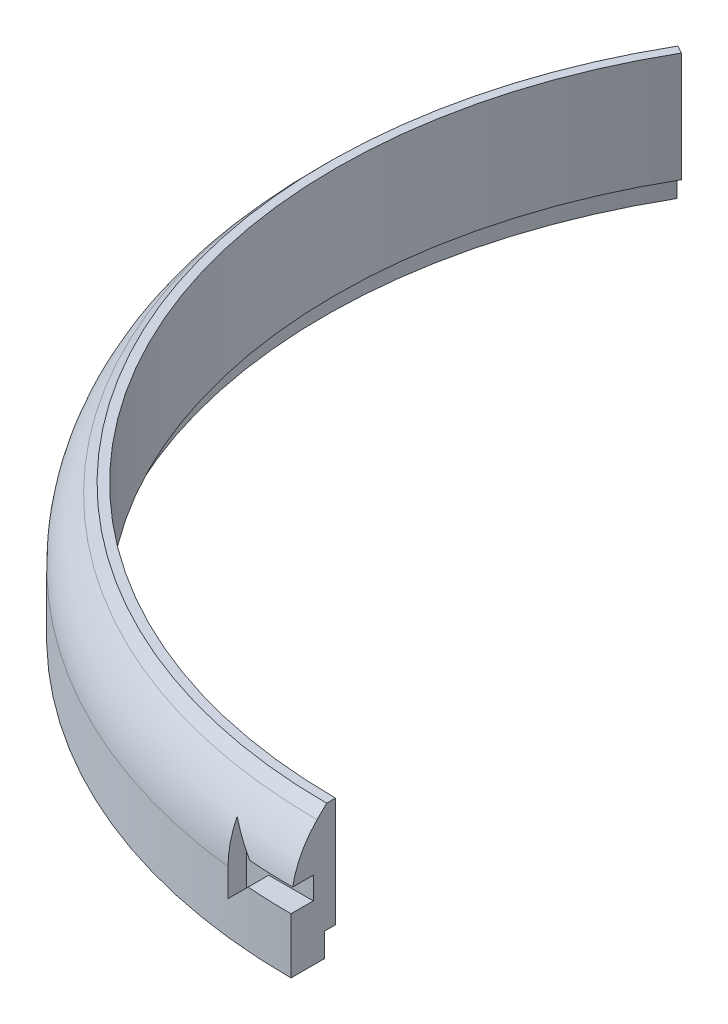
ISO-10303-21;
HEADER;
FILE_DESCRIPTION(('STEP AP214'),'2;1');
FILE_NAME('part.step','',(''),(''),'','','');
FILE_SCHEMA(('AUTOMOTIVE_DESIGN { 1 0 10303 214 1 1 1 1 }'));
ENDSEC;
DATA;
#1=APPLICATION_CONTEXT('core data for automotive mechanical design processes');
#2=APPLICATION_PROTOCOL_DEFINITION('international standard','automotive_design',2000,#1);
#3=PRODUCT_CONTEXT('',#1,'mechanical');
#4=PRODUCT('Part','Part','',(#3));
#5=PRODUCT_RELATED_PRODUCT_CATEGORY('part','',(#4));
#6=PRODUCT_DEFINITION_FORMATION('','',#4);
#7=PRODUCT_DEFINITION_CONTEXT('part definition',#1,'design');
#8=PRODUCT_DEFINITION('design','',#6,#7);
#9=PRODUCT_DEFINITION_SHAPE('','',#8);
#10=(LENGTH_UNIT() NAMED_UNIT(*) SI_UNIT(.MILLI.,.METRE.));
#11=(NAMED_UNIT(*) PLANE_ANGLE_UNIT() SI_UNIT($,.RADIAN.));
#12=(NAMED_UNIT(*) SI_UNIT($,.STERADIAN.) SOLID_ANGLE_UNIT());
#13=UNCERTAINTY_MEASURE_WITH_UNIT(LENGTH_MEASURE(1.E-05),#10,'distance_accuracy_value','');
#14=(GEOMETRIC_REPRESENTATION_CONTEXT(3) GLOBAL_UNCERTAINTY_ASSIGNED_CONTEXT((#13)) GLOBAL_UNIT_ASSIGNED_CONTEXT((#10,
#11,#12)) REPRESENTATION_CONTEXT('',''));
#15=CARTESIAN_POINT('',(0.,0.,0.));
#16=DIRECTION('',(0.,0.,1.));
#17=DIRECTION('',(1.,0.,0.));
#18=AXIS2_PLACEMENT_3D('',#15,#16,#17);
#19=CARTESIAN_POINT('',(0.,30.,0.));
#20=DIRECTION('',(0.,-1.,0.));
#21=DIRECTION('',(0.,0.,-1.));
#22=AXIS2_PLACEMENT_3D('',#19,#20,#21);
#23=CYLINDRICAL_SURFACE('',#22,132.5);
#24=DIRECTION('',(0.,-1.,0.));
#25=VECTOR('',#24,1.);
#26=CARTESIAN_POINT('',(-15.,30.,131.648205456816));
#27=LINE('',#26,#25);
#28=CARTESIAN_POINT('',(-15.,7.49999999999998,131.648205456816));
#29=VERTEX_POINT('',#28);
#30=CARTESIAN_POINT('',(-15.,13.7157287525382,131.648205456816));
#31=VERTEX_POINT('',#30);
#32=EDGE_CURVE('E349',#29,#31,#27,.F.);
#33=ORIENTED_EDGE('',*,*,#32,.T.);
#34=CARTESIAN_POINT('',(0.,13.7157287525382,0.));
#35=DIRECTION('',(0.,1.,0.));
#36=DIRECTION('',(0.,0.,1.));
#37=AXIS2_PLACEMENT_3D('',#34,#35,#36);
#38=CIRCLE('',#37,132.5);
#39=CARTESIAN_POINT('',(-121.510690288236,13.7157287525382,-52.8337216716414));
#40=VERTEX_POINT('',#39);
#41=EDGE_CURVE('E382',#31,#40,#38,.F.);
#42=ORIENTED_EDGE('',*,*,#41,.T.);
#43=DIRECTION('',(0.,-1.,0.));
#44=VECTOR('',#43,1.);
#45=CARTESIAN_POINT('',(-121.510690288236,30.,-52.8337216716414));
#46=LINE('',#45,#44);
#47=CARTESIAN_POINT('',(-121.510690288236,7.49999999999998,-52.8337216716415));
#48=VERTEX_POINT('',#47);
#49=EDGE_CURVE('E367',#48,#40,#46,.F.);
#50=ORIENTED_EDGE('',*,*,#49,.F.);
#51=CARTESIAN_POINT('',(0.,22.5,0.));
#52=DIRECTION('',(-0.353553390593275,0.707106781186546,0.612372435695795));
#53=DIRECTION('',(-0.353553390593274,-0.707106781186549,0.612372435695793));
#54=AXIS2_PLACEMENT_3D('',#51,#52,#53);
#55=ELLIPSE('',#54,187.383297014435,132.5);
#56=CARTESIAN_POINT('',(-119.421097267943,12.5,-57.4007972707748));
#57=VERTEX_POINT('',#56);
#58=EDGE_CURVE('E364',#57,#48,#55,.T.);
#59=ORIENTED_EDGE('',*,*,#58,.F.);
#60=CARTESIAN_POINT('',(0.,12.5,0.));
#61=DIRECTION('',(0.,-1.,0.));
#62=DIRECTION('',(0.,0.,-1.));
#63=AXIS2_PLACEMENT_3D('',#60,#61,#62);
#64=CIRCLE('',#63,132.5);
#65=CARTESIAN_POINT('',(-114.748366001438,12.5,-66.2500000000006));
#66=VERTEX_POINT('',#65);
#67=EDGE_CURVE('E360',#57,#66,#64,.T.);
#68=ORIENTED_EDGE('',*,*,#67,.T.);
#69=DIRECTION('',(0.,-1.,0.));
#70=VECTOR('',#69,1.);
#71=CARTESIAN_POINT('',(-114.748366001438,30.,-66.2500000000006));
#72=LINE('',#71,#70);
#73=CARTESIAN_POINT('',(-114.748366001438,0.,-66.2500000000006));
#74=VERTEX_POINT('',#73);
#75=EDGE_CURVE('E330',#66,#74,#72,.T.);
#76=ORIENTED_EDGE('',*,*,#75,.T.);
#77=CARTESIAN_POINT('',(0.,0.,0.));
#78=DIRECTION('',(0.,1.,0.));
#79=DIRECTION('',(0.,0.,1.));
#80=AXIS2_PLACEMENT_3D('',#77,#78,#79);
#81=CIRCLE('',#80,132.5);
#82=CARTESIAN_POINT('',(0.,0.,132.5));
#83=VERTEX_POINT('',#82);
#84=EDGE_CURVE('E313',#74,#83,#81,.T.);
#85=ORIENTED_EDGE('',*,*,#84,.T.);
#86=DIRECTION('',(0.,-1.,0.));
#87=VECTOR('',#86,1.);
#88=CARTESIAN_POINT('',(0.,30.,132.5));
#89=LINE('',#88,#87);
#90=CARTESIAN_POINT('',(0.,12.5,132.5));
#91=VERTEX_POINT('',#90);
#92=EDGE_CURVE('E334',#91,#83,#89,.T.);
#93=ORIENTED_EDGE('',*,*,#92,.F.);
#94=CARTESIAN_POINT('',(0.,12.5,0.));
#95=DIRECTION('',(0.,1.,0.));
#96=DIRECTION('',(-1.,0.,0.));
#97=AXIS2_PLACEMENT_3D('',#94,#95,#96);
#98=CIRCLE('',#97,132.5);
#99=CARTESIAN_POINT('',(-10.,12.5,132.122102617238));
#100=VERTEX_POINT('',#99);
#101=EDGE_CURVE('E357',#100,#91,#98,.T.);
#102=ORIENTED_EDGE('',*,*,#101,.F.);
#103=CARTESIAN_POINT('',(0.,22.5,0.));
#104=DIRECTION('',(0.707106781186549,-0.707106781186546,0.));
#105=DIRECTION('',(-0.707106781186546,-0.707106781186549,0.));
#106=AXIS2_PLACEMENT_3D('',#103,#104,#105);
#107=ELLIPSE('',#106,187.383297014435,132.5);
#108=EDGE_CURVE('E353',#100,#29,#107,.T.);
#109=ORIENTED_EDGE('',*,*,#108,.T.);
#110=EDGE_LOOP('',(#33,#42,#50,#59,#68,#76,#85,#93,#102,#109));
#111=FACE_BOUND('',#110,.T.);
#112=ADVANCED_FACE('F45',(#111),#23,.T.);
#113=CARTESIAN_POINT('',(-114.748366001438,30.,-66.2500000000005));
#114=DIRECTION('',(0.500000000000001,0.,-0.866025403784438));
#115=DIRECTION('',(-0.866025403784438,0.,-0.500000000000001));
#116=AXIS2_PLACEMENT_3D('',#113,#114,#115);
#117=PLANE('',#116);
#118=DIRECTION('',(-0.866025403784438,0.,-0.500000000000001));
#119=VECTOR('',#118,1.);
#120=CARTESIAN_POINT('',(-110.418238982516,17.5,-63.7500000000001));
#121=LINE('',#120,#119);
#122=CARTESIAN_POINT('',(-110.418238982516,17.5,-63.7500000000001));
#123=VERTEX_POINT('',#122);
#124=CARTESIAN_POINT('',(-114.435487635507,17.5,-66.0693595912061));
#125=VERTEX_POINT('',#124);
#126=EDGE_CURVE('E188',#123,#125,#121,.T.);
#127=ORIENTED_EDGE('',*,*,#126,.T.);
#128=CARTESIAN_POINT('',(-97.4278579257493,13.7157287525382,-56.2500000000002));
#129=DIRECTION('',(0.500000000000001,0.,-0.866025403784438));
#130=DIRECTION('',(-0.866025403784438,0.,-0.500000000000001));
#131=AXIS2_PLACEMENT_3D('',#128,#129,#130);
#132=CIRCLE('',#131,20.);
#133=CARTESIAN_POINT('',(-109.675306639665,27.857864376269,-63.3210678118661));
#134=VERTEX_POINT('',#133);
#135=EDGE_CURVE('E455',#125,#134,#132,.T.);
#136=ORIENTED_EDGE('',*,*,#135,.T.);
#137=DIRECTION('',(0.612372435695792,0.70710678118655,0.353553390593274));
#138=VECTOR('',#137,1.);
#139=CARTESIAN_POINT('',(2.0122792321331E-13,154.500000000001,-3.48536986907021E-13));
#140=LINE('',#139,#138);
#141=CARTESIAN_POINT('',(-107.820162771162,30.,-62.2500000000006));
#142=VERTEX_POINT('',#141);
#143=EDGE_CURVE('E379',#134,#142,#140,.T.);
#144=ORIENTED_EDGE('',*,*,#143,.T.);
#145=DIRECTION('',(0.866025403784438,0.,0.500000000000001));
#146=VECTOR('',#145,1.);
#147=CARTESIAN_POINT('',(-114.748366001438,30.,-66.2500000000005));
#148=LINE('',#147,#146);
#149=CARTESIAN_POINT('',(-106.088111963593,30.,-61.2500000000005));
#150=VERTEX_POINT('',#149);
#151=EDGE_CURVE('E309',#142,#150,#148,.T.);
#152=ORIENTED_EDGE('',*,*,#151,.T.);
#153=DIRECTION('',(0.,-1.,0.));
#154=VECTOR('',#153,1.);
#155=CARTESIAN_POINT('',(-106.088111963593,30.,-61.2500000000005));
#156=LINE('',#155,#154);
#157=CARTESIAN_POINT('',(-106.088111963593,5.35,-61.2500000000005));
#158=VERTEX_POINT('',#157);
#159=EDGE_CURVE('E320',#150,#158,#156,.T.);
#160=ORIENTED_EDGE('',*,*,#159,.T.);
#161=DIRECTION('',(0.866025403784438,0.,0.500000000000001));
#162=VECTOR('',#161,1.);
#163=CARTESIAN_POINT('',(-114.748366001438,5.35,-66.2500000000005));
#164=LINE('',#163,#162);
#165=CARTESIAN_POINT('',(-108.253175473055,5.35,-62.5000000000005));
#166=VERTEX_POINT('',#165);
#167=EDGE_CURVE('E305',#166,#158,#164,.T.);
#168=ORIENTED_EDGE('',*,*,#167,.F.);
#169=DIRECTION('',(0.,-1.,0.));
#170=VECTOR('',#169,1.);
#171=CARTESIAN_POINT('',(-108.253175473055,5.35,-62.5000000000005));
#172=LINE('',#171,#170);
#173=CARTESIAN_POINT('',(-108.253175473055,0.,-62.5000000000005));
#174=VERTEX_POINT('',#173);
#175=EDGE_CURVE('E297',#166,#174,#172,.T.);
#176=ORIENTED_EDGE('',*,*,#175,.T.);
#177=DIRECTION('',(0.866025403784438,0.,0.500000000000001));
#178=VECTOR('',#177,1.);
#179=CARTESIAN_POINT('',(-114.748366001438,0.,-66.2500000000005));
#180=LINE('',#179,#178);
#181=EDGE_CURVE('E308',#74,#174,#180,.T.);
#182=ORIENTED_EDGE('',*,*,#181,.F.);
#183=ORIENTED_EDGE('',*,*,#75,.F.);
#184=DIRECTION('',(-0.866025403784438,0.,-0.500000000000001));
#185=VECTOR('',#184,1.);
#186=CARTESIAN_POINT('',(-110.418238982516,12.5,-63.7500000000001));
#187=LINE('',#186,#185);
#188=CARTESIAN_POINT('',(-110.418238982516,12.5,-63.7500000000001));
#189=VERTEX_POINT('',#188);
#190=EDGE_CURVE('E200',#189,#66,#187,.T.);
#191=ORIENTED_EDGE('',*,*,#190,.F.);
#192=DIRECTION('',(0.,-1.,0.));
#193=VECTOR('',#192,1.);
#194=CARTESIAN_POINT('',(-110.418238982516,0.,-63.7500000000001));
#195=LINE('',#194,#193);
#196=EDGE_CURVE('E207',#123,#189,#195,.T.);
#197=ORIENTED_EDGE('',*,*,#196,.F.);
#198=EDGE_LOOP('',(#127,#136,#144,#152,#160,#168,#176,#182,#183,#191,#197));
#199=FACE_BOUND('',#198,.T.);
#200=ADVANCED_FACE('F212',(#199),#117,.T.);
#201=CARTESIAN_POINT('',(0.,30.,132.5));
#202=DIRECTION('',(-1.,0.,0.));
#203=DIRECTION('',(0.,0.,1.));
#204=AXIS2_PLACEMENT_3D('',#201,#202,#203);
#205=PLANE('',#204);
#206=DIRECTION('',(0.,0.70710678118655,-0.707106781186545));
#207=VECTOR('',#206,1.);
#208=CARTESIAN_POINT('',(0.,154.500000000001,0.));
#209=LINE('',#208,#207);
#210=CARTESIAN_POINT('',(0.,30.,124.5));
#211=VERTEX_POINT('',#210);
#212=CARTESIAN_POINT('',(0.,27.8578643762691,126.642135623731));
#213=VERTEX_POINT('',#212);
#214=EDGE_CURVE('E375',#211,#213,#209,.F.);
#215=ORIENTED_EDGE('',*,*,#214,.T.);
#216=CARTESIAN_POINT('',(0.,13.7157287525382,112.5));
#217=DIRECTION('',(-1.,0.,0.));
#218=DIRECTION('',(0.,0.,1.));
#219=AXIS2_PLACEMENT_3D('',#216,#217,#218);
#220=CIRCLE('',#219,20.);
#221=CARTESIAN_POINT('',(0.,17.5,132.138719182412));
#222=VERTEX_POINT('',#221);
#223=EDGE_CURVE('E449',#213,#222,#220,.F.);
#224=ORIENTED_EDGE('',*,*,#223,.T.);
#225=DIRECTION('',(0.,0.,1.));
#226=VECTOR('',#225,1.);
#227=CARTESIAN_POINT('',(0.,17.5,127.5));
#228=LINE('',#227,#226);
#229=CARTESIAN_POINT('',(0.,17.5,127.5));
#230=VERTEX_POINT('',#229);
#231=EDGE_CURVE('E271',#230,#222,#228,.T.);
#232=ORIENTED_EDGE('',*,*,#231,.F.);
#233=DIRECTION('',(0.,-1.,0.));
#234=VECTOR('',#233,1.);
#235=CARTESIAN_POINT('',(0.,0.,127.5));
#236=LINE('',#235,#234);
#237=CARTESIAN_POINT('',(0.,12.5,127.5));
#238=VERTEX_POINT('',#237);
#239=EDGE_CURVE('E266',#230,#238,#236,.T.);
#240=ORIENTED_EDGE('',*,*,#239,.T.);
#241=DIRECTION('',(0.,0.,1.));
#242=VECTOR('',#241,1.);
#243=CARTESIAN_POINT('',(0.,12.5,127.5));
#244=LINE('',#243,#242);
#245=EDGE_CURVE('E275',#238,#91,#244,.T.);
#246=ORIENTED_EDGE('',*,*,#245,.T.);
#247=ORIENTED_EDGE('',*,*,#92,.T.);
#248=DIRECTION('',(0.,0.,-1.));
#249=VECTOR('',#248,1.);
#250=CARTESIAN_POINT('',(0.,0.,132.5));
#251=LINE('',#250,#249);
#252=CARTESIAN_POINT('',(0.,0.,125.));
#253=VERTEX_POINT('',#252);
#254=EDGE_CURVE('E324',#83,#253,#251,.T.);
#255=ORIENTED_EDGE('',*,*,#254,.T.);
#256=DIRECTION('',(0.,-1.,0.));
#257=VECTOR('',#256,1.);
#258=CARTESIAN_POINT('',(0.,5.35,125.));
#259=LINE('',#258,#257);
#260=CARTESIAN_POINT('',(0.,5.35,125.));
#261=VERTEX_POINT('',#260);
#262=EDGE_CURVE('E295',#261,#253,#259,.T.);
#263=ORIENTED_EDGE('',*,*,#262,.F.);
#264=DIRECTION('',(0.,0.,-1.));
#265=VECTOR('',#264,1.);
#266=CARTESIAN_POINT('',(0.,5.35,132.5));
#267=LINE('',#266,#265);
#268=CARTESIAN_POINT('',(0.,5.35,122.5));
#269=VERTEX_POINT('',#268);
#270=EDGE_CURVE('E301',#261,#269,#267,.T.);
#271=ORIENTED_EDGE('',*,*,#270,.T.);
#272=DIRECTION('',(0.,-1.,0.));
#273=VECTOR('',#272,1.);
#274=CARTESIAN_POINT('',(0.,30.,122.5));
#275=LINE('',#274,#273);
#276=CARTESIAN_POINT('',(0.,30.,122.5));
#277=VERTEX_POINT('',#276);
#278=EDGE_CURVE('E337',#277,#269,#275,.T.);
#279=ORIENTED_EDGE('',*,*,#278,.F.);
#280=DIRECTION('',(0.,0.,-1.));
#281=VECTOR('',#280,1.);
#282=CARTESIAN_POINT('',(0.,30.,132.5));
#283=LINE('',#282,#281);
#284=EDGE_CURVE('E317',#211,#277,#283,.T.);
#285=ORIENTED_EDGE('',*,*,#284,.F.);
#286=EDGE_LOOP('',(#215,#224,#232,#240,#246,#247,#255,#263,#271,#279,#285));
#287=FACE_BOUND('',#286,.T.);
#288=ADVANCED_FACE('F476',(#287),#205,.F.);
#289=CARTESIAN_POINT('',(0.,30.,0.));
#290=DIRECTION('',(0.,-1.,0.));
#291=DIRECTION('',(0.,0.,-1.));
#292=AXIS2_PLACEMENT_3D('',#289,#290,#291);
#293=CYLINDRICAL_SURFACE('',#292,122.5);
#294=CARTESIAN_POINT('',(0.,5.35,0.));
#295=DIRECTION('',(0.,1.,0.));
#296=DIRECTION('',(0.,0.,1.));
#297=AXIS2_PLACEMENT_3D('',#294,#295,#296);
#298=CIRCLE('',#297,122.5);
#299=EDGE_CURVE('E346',#158,#269,#298,.T.);
#300=ORIENTED_EDGE('',*,*,#299,.F.);
#301=ORIENTED_EDGE('',*,*,#159,.F.);
#302=CARTESIAN_POINT('',(0.,30.,0.));
#303=DIRECTION('',(0.,1.,0.));
#304=DIRECTION('',(0.,0.,1.));
#305=AXIS2_PLACEMENT_3D('',#302,#303,#304);
#306=CIRCLE('',#305,122.5);
#307=EDGE_CURVE('E312',#150,#277,#306,.T.);
#308=ORIENTED_EDGE('',*,*,#307,.T.);
#309=ORIENTED_EDGE('',*,*,#278,.T.);
#310=EDGE_LOOP('',(#300,#301,#308,#309));
#311=FACE_BOUND('',#310,.T.);
#312=ADVANCED_FACE('F481',(#311),#293,.F.);
#313=CARTESIAN_POINT('',(0.,30.,0.));
#314=DIRECTION('',(0.,1.,0.));
#315=DIRECTION('',(0.,0.,1.));
#316=AXIS2_PLACEMENT_3D('',#313,#314,#315);
#317=PLANE('',#316);
#318=ORIENTED_EDGE('',*,*,#151,.F.);
#319=CARTESIAN_POINT('',(0.,30.,0.));
#320=DIRECTION('',(0.,1.,0.));
#321=DIRECTION('',(0.,0.,1.));
#322=AXIS2_PLACEMENT_3D('',#319,#320,#321);
#323=CIRCLE('',#322,124.5);
#324=EDGE_CURVE('E371',#142,#211,#323,.T.);
#325=ORIENTED_EDGE('',*,*,#324,.T.);
#326=ORIENTED_EDGE('',*,*,#284,.T.);
#327=ORIENTED_EDGE('',*,*,#307,.F.);
#328=EDGE_LOOP('',(#318,#325,#326,#327));
#329=FACE_BOUND('',#328,.T.);
#330=ADVANCED_FACE('F472',(#329),#317,.T.);
#331=CARTESIAN_POINT('',(0.,0.,0.));
#332=DIRECTION('',(0.,1.,0.));
#333=DIRECTION('',(0.,0.,1.));
#334=AXIS2_PLACEMENT_3D('',#331,#332,#333);
#335=PLANE('',#334);
#336=CARTESIAN_POINT('',(0.,0.,0.));
#337=DIRECTION('',(0.,1.,0.));
#338=DIRECTION('',(0.,0.,1.));
#339=AXIS2_PLACEMENT_3D('',#336,#337,#338);
#340=CIRCLE('',#339,125.);
#341=EDGE_CURVE('E333',#253,#174,#340,.F.);
#342=ORIENTED_EDGE('',*,*,#341,.F.);
#343=ORIENTED_EDGE('',*,*,#254,.F.);
#344=ORIENTED_EDGE('',*,*,#84,.F.);
#345=ORIENTED_EDGE('',*,*,#181,.T.);
#346=EDGE_LOOP('',(#342,#343,#344,#345));
#347=FACE_BOUND('',#346,.T.);
#348=ADVANCED_FACE('F494',(#347),#335,.F.);
#349=CARTESIAN_POINT('',(0.,5.35,0.));
#350=DIRECTION('',(0.,-1.,0.));
#351=DIRECTION('',(0.,0.,-1.));
#352=AXIS2_PLACEMENT_3D('',#349,#350,#351);
#353=CYLINDRICAL_SURFACE('',#352,125.);
#354=CARTESIAN_POINT('',(0.,5.35,0.));
#355=DIRECTION('',(0.,1.,0.));
#356=DIRECTION('',(0.,0.,1.));
#357=AXIS2_PLACEMENT_3D('',#354,#355,#356);
#358=CIRCLE('',#357,125.);
#359=EDGE_CURVE('E274',#166,#261,#358,.T.);
#360=ORIENTED_EDGE('',*,*,#359,.T.);
#361=ORIENTED_EDGE('',*,*,#262,.T.);
#362=ORIENTED_EDGE('',*,*,#341,.T.);
#363=ORIENTED_EDGE('',*,*,#175,.F.);
#364=EDGE_LOOP('',(#360,#361,#362,#363));
#365=FACE_BOUND('',#364,.T.);
#366=ADVANCED_FACE('F488',(#365),#353,.F.);
#367=CARTESIAN_POINT('',(0.,5.35,0.));
#368=DIRECTION('',(0.,1.,0.));
#369=DIRECTION('',(0.,0.,1.));
#370=AXIS2_PLACEMENT_3D('',#367,#368,#369);
#371=PLANE('',#370);
#372=ORIENTED_EDGE('',*,*,#167,.T.);
#373=ORIENTED_EDGE('',*,*,#299,.T.);
#374=ORIENTED_EDGE('',*,*,#270,.F.);
#375=ORIENTED_EDGE('',*,*,#359,.F.);
#376=EDGE_LOOP('',(#372,#373,#374,#375));
#377=FACE_BOUND('',#376,.T.);
#378=ADVANCED_FACE('F486',(#377),#371,.F.);
#379=CARTESIAN_POINT('',(0.,17.5,127.5));
#380=DIRECTION('',(0.,1.,0.));
#381=DIRECTION('',(-1.,0.,0.));
#382=AXIS2_PLACEMENT_3D('',#379,#380,#381);
#383=PLANE('',#382);
#384=ORIENTED_EDGE('',*,*,#231,.T.);
#385=CARTESIAN_POINT('',(0.,17.5,0.));
#386=DIRECTION('',(0.,1.,0.));
#387=DIRECTION('',(0.,0.,1.));
#388=AXIS2_PLACEMENT_3D('',#385,#386,#387);
#389=CIRCLE('',#388,132.138719182412);
#390=CARTESIAN_POINT('',(-10.,17.5,131.759785622049));
#391=VERTEX_POINT('',#390);
#392=EDGE_CURVE('E74',#222,#391,#389,.F.);
#393=ORIENTED_EDGE('',*,*,#392,.T.);
#394=DIRECTION('',(0.,0.,1.));
#395=VECTOR('',#394,1.);
#396=CARTESIAN_POINT('',(-10.,17.5,127.5));
#397=LINE('',#396,#395);
#398=CARTESIAN_POINT('',(-10.,17.5,127.5));
#399=VERTEX_POINT('',#398);
#400=EDGE_CURVE('E270',#399,#391,#397,.T.);
#401=ORIENTED_EDGE('',*,*,#400,.F.);
#402=DIRECTION('',(-1.,0.,0.));
#403=VECTOR('',#402,1.);
#404=CARTESIAN_POINT('',(0.,17.5,127.5));
#405=LINE('',#404,#403);
#406=EDGE_CURVE('E233',#230,#399,#405,.T.);
#407=ORIENTED_EDGE('',*,*,#406,.F.);
#408=EDGE_LOOP('',(#384,#393,#401,#407));
#409=FACE_BOUND('',#408,.T.);
#410=ADVANCED_FACE('F428',(#409),#383,.F.);
#411=CARTESIAN_POINT('',(0.,12.5,127.5));
#412=DIRECTION('',(0.,1.,0.));
#413=DIRECTION('',(-1.,0.,0.));
#414=AXIS2_PLACEMENT_3D('',#411,#412,#413);
#415=PLANE('',#414);
#416=ORIENTED_EDGE('',*,*,#101,.T.);
#417=ORIENTED_EDGE('',*,*,#245,.F.);
#418=DIRECTION('',(-1.,0.,0.));
#419=VECTOR('',#418,1.);
#420=CARTESIAN_POINT('',(0.,12.5,127.5));
#421=LINE('',#420,#419);
#422=CARTESIAN_POINT('',(-10.,12.5,127.5));
#423=VERTEX_POINT('',#422);
#424=EDGE_CURVE('E263',#238,#423,#421,.T.);
#425=ORIENTED_EDGE('',*,*,#424,.T.);
#426=DIRECTION('',(0.,0.,1.));
#427=VECTOR('',#426,1.);
#428=CARTESIAN_POINT('',(-10.,12.5,127.5));
#429=LINE('',#428,#427);
#430=EDGE_CURVE('E279',#423,#100,#429,.T.);
#431=ORIENTED_EDGE('',*,*,#430,.T.);
#432=EDGE_LOOP('',(#416,#417,#425,#431));
#433=FACE_BOUND('',#432,.T.);
#434=ADVANCED_FACE('F424',(#433),#415,.T.);
#435=CARTESIAN_POINT('',(-11.25,11.25,127.5));
#436=DIRECTION('',(0.707106781186549,-0.707106781186546,0.));
#437=DIRECTION('',(0.707106781186546,0.707106781186549,0.));
#438=AXIS2_PLACEMENT_3D('',#435,#436,#437);
#439=PLANE('',#438);
#440=ORIENTED_EDGE('',*,*,#430,.F.);
#441=DIRECTION('',(0.707106781186546,0.707106781186549,0.));
#442=VECTOR('',#441,1.);
#443=CARTESIAN_POINT('',(-11.25,11.25,127.5));
#444=LINE('',#443,#442);
#445=CARTESIAN_POINT('',(-15.,7.49999999999998,127.5));
#446=VERTEX_POINT('',#445);
#447=EDGE_CURVE('E259',#446,#423,#444,.T.);
#448=ORIENTED_EDGE('',*,*,#447,.F.);
#449=DIRECTION('',(0.,0.,1.));
#450=VECTOR('',#449,1.);
#451=CARTESIAN_POINT('',(-15.,7.49999999999998,127.5));
#452=LINE('',#451,#450);
#453=EDGE_CURVE('E283',#446,#29,#452,.T.);
#454=ORIENTED_EDGE('',*,*,#453,.T.);
#455=ORIENTED_EDGE('',*,*,#108,.F.);
#456=EDGE_LOOP('',(#440,#448,#454,#455));
#457=FACE_BOUND('',#456,.T.);
#458=ADVANCED_FACE('F427',(#457),#439,.F.);
#459=CARTESIAN_POINT('',(-15.,0.,127.5));
#460=DIRECTION('',(-1.,0.,0.));
#461=DIRECTION('',(0.,-1.,0.));
#462=AXIS2_PLACEMENT_3D('',#459,#460,#461);
#463=PLANE('',#462);
#464=DIRECTION('',(0.,0.,1.));
#465=VECTOR('',#464,1.);
#466=CARTESIAN_POINT('',(-15.,22.5,127.5));
#467=LINE('',#466,#465);
#468=CARTESIAN_POINT('',(-15.,22.5,127.5));
#469=VERTEX_POINT('',#468);
#470=CARTESIAN_POINT('',(-15.,22.5,129.602502506475));
#471=VERTEX_POINT('',#470);
#472=EDGE_CURVE('E287',#469,#471,#467,.T.);
#473=ORIENTED_EDGE('',*,*,#472,.T.);
#474=CARTESIAN_POINT('',(-15.,22.5,129.602502506475));
#475=CARTESIAN_POINT('',(-15.,22.246737377971,129.727147075134));
#476=CARTESIAN_POINT('',(-15.,21.9908594857028,129.846397177026));
#477=CARTESIAN_POINT('',(-15.,21.4742678345848,130.073923358693));
#478=CARTESIAN_POINT('',(-15.,21.2135540353195,130.182199346705));
#479=CARTESIAN_POINT('',(-15.,20.4246313556867,130.490334669018));
#480=CARTESIAN_POINT('',(-15.,19.889762810441,130.673441514442));
#481=CARTESIAN_POINT('',(-15.,18.8166993641185,130.990455228814));
#482=CARTESIAN_POINT('',(-15.,18.2787574854764,131.125224940977));
#483=CARTESIAN_POINT('',(-15.,17.193749794511,131.349320350948));
#484=CARTESIAN_POINT('',(-15.,16.6466894166416,131.438672182548));
#485=CARTESIAN_POINT('',(-15.,15.7033016869705,131.552533831955));
#486=CARTESIAN_POINT('',(-15.,15.3082889507298,131.588251940482));
#487=CARTESIAN_POINT('',(-15.,14.5141143974798,131.636174475837));
#488=CARTESIAN_POINT('',(-15.,14.1149427234748,131.648215606362));
#489=CARTESIAN_POINT('',(-15.,13.7157287525382,131.648205456816));
#490=B_SPLINE_CURVE_WITH_KNOTS('',3,(#474,#475,#476,#477,#478,#479,#480,#481,#482,#483,#484,
#485,#486,#487,#488,#489),.UNSPECIFIED.,.F.,.F.,(4,2,2,2,2,2,2,4),(0.,0.846685072759808,
1.69337722474848,3.38716683932338,5.04900907117282,6.70989398092594,7.89909699047645,
9.09647336816671),.UNSPECIFIED.);
#491=EDGE_CURVE('E11',#471,#31,#490,.T.);
#492=ORIENTED_EDGE('',*,*,#491,.T.);
#493=ORIENTED_EDGE('',*,*,#32,.F.);
#494=ORIENTED_EDGE('',*,*,#453,.F.);
#495=DIRECTION('',(0.,-1.,0.));
#496=VECTOR('',#495,1.);
#497=CARTESIAN_POINT('',(-15.,0.,127.5));
#498=LINE('',#497,#496);
#499=EDGE_CURVE('E255',#469,#446,#498,.T.);
#500=ORIENTED_EDGE('',*,*,#499,.F.);
#501=EDGE_LOOP('',(#473,#492,#493,#494,#500));
#502=FACE_BOUND('',#501,.T.);
#503=ADVANCED_FACE('F431',(#502),#463,.F.);
#504=CARTESIAN_POINT('',(3.74999999999999,3.74999999999998,127.5));
#505=DIRECTION('',(0.707106781186549,0.707106781186547,0.));
#506=DIRECTION('',(-0.707106781186547,0.707106781186549,0.));
#507=AXIS2_PLACEMENT_3D('',#504,#505,#506);
#508=PLANE('',#507);
#509=ORIENTED_EDGE('',*,*,#400,.T.);
#510=CARTESIAN_POINT('',(-10.,17.5,131.759785622049));
#511=CARTESIAN_POINT('',(-10.4294200014649,17.9294200014649,131.644206761699));
#512=CARTESIAN_POINT('',(-10.8566658944844,18.3566658944844,131.51239550869));
#513=CARTESIAN_POINT('',(-11.704268217209,19.204268217209,131.216885747214));
#514=CARTESIAN_POINT('',(-12.1246412566888,19.6246412566889,131.053282482889));
#515=CARTESIAN_POINT('',(-12.9585022658971,20.4585022658971,130.694083820244));
#516=CARTESIAN_POINT('',(-13.3719902991247,20.8719902991247,130.49848871716));
#517=CARTESIAN_POINT('',(-14.1919433306319,21.6919433306319,130.074812079871));
#518=CARTESIAN_POINT('',(-14.5983839213115,22.0983839213115,129.846636110804));
#519=CARTESIAN_POINT('',(-15.,22.5,129.602502506475));
#520=B_SPLINE_CURVE_WITH_KNOTS('',3,(#510,#511,#512,#513,#514,#515,#516,#517,#518,#519),
.UNSPECIFIED.,.F.,.F.,(4,2,2,2,4),(0.,1.85437648133057,3.70328086877425,5.55216819468571,
7.406527563315),.UNSPECIFIED.);
#521=EDGE_CURVE('E60',#391,#471,#520,.T.);
#522=ORIENTED_EDGE('',*,*,#521,.T.);
#523=ORIENTED_EDGE('',*,*,#472,.F.);
#524=DIRECTION('',(-0.707106781186547,0.707106781186549,0.));
#525=VECTOR('',#524,1.);
#526=CARTESIAN_POINT('',(3.74999999999999,3.74999999999998,127.5));
#527=LINE('',#526,#525);
#528=EDGE_CURVE('E251',#399,#469,#527,.T.);
#529=ORIENTED_EDGE('',*,*,#528,.F.);
#530=EDGE_LOOP('',(#509,#522,#523,#529));
#531=FACE_BOUND('',#530,.T.);
#532=ADVANCED_FACE('F422',(#531),#508,.F.);
#533=CARTESIAN_POINT('',(0.,0.,127.5));
#534=DIRECTION('',(0.,0.,1.));
#535=DIRECTION('',(1.,0.,0.));
#536=AXIS2_PLACEMENT_3D('',#533,#534,#535);
#537=PLANE('',#536);
#538=ORIENTED_EDGE('',*,*,#406,.T.);
#539=ORIENTED_EDGE('',*,*,#528,.T.);
#540=ORIENTED_EDGE('',*,*,#499,.T.);
#541=ORIENTED_EDGE('',*,*,#447,.T.);
#542=ORIENTED_EDGE('',*,*,#424,.F.);
#543=ORIENTED_EDGE('',*,*,#239,.F.);
#544=EDGE_LOOP('',(#538,#539,#540,#541,#542,#543));
#545=FACE_BOUND('',#544,.T.);
#546=ADVANCED_FACE('F419',(#545),#537,.T.);
#547=CARTESIAN_POINT('',(-110.418238982516,17.5,-63.7500000000001));
#548=DIRECTION('',(0.,-1.,0.));
#549=DIRECTION('',(0.,0.,-1.));
#550=AXIS2_PLACEMENT_3D('',#547,#548,#549);
#551=PLANE('',#550);
#552=DIRECTION('',(-0.866025403784438,0.,-0.500000000000001));
#553=VECTOR('',#552,1.);
#554=CARTESIAN_POINT('',(-115.418238982516,17.5,-55.0897459621557));
#555=LINE('',#554,#553);
#556=CARTESIAN_POINT('',(-115.418238982516,17.5,-55.0897459621557));
#557=VERTEX_POINT('',#556);
#558=CARTESIAN_POINT('',(-119.107321545886,17.5,-57.2196387731803));
#559=VERTEX_POINT('',#558);
#560=EDGE_CURVE('E230',#557,#559,#555,.T.);
#561=ORIENTED_EDGE('',*,*,#560,.T.);
#562=CARTESIAN_POINT('',(0.,17.5,0.));
#563=DIRECTION('',(0.,1.,0.));
#564=DIRECTION('',(0.,0.,1.));
#565=AXIS2_PLACEMENT_3D('',#562,#563,#564);
#566=CIRCLE('',#565,132.138719182412);
#567=EDGE_CURVE('E195',#559,#125,#566,.F.);
#568=ORIENTED_EDGE('',*,*,#567,.T.);
#569=ORIENTED_EDGE('',*,*,#126,.F.);
#570=DIRECTION('',(-0.500000000000001,0.,0.866025403784438));
#571=VECTOR('',#570,1.);
#572=CARTESIAN_POINT('',(-110.418238982516,17.5,-63.7500000000001));
#573=LINE('',#572,#571);
#574=EDGE_CURVE('E192',#123,#557,#573,.T.);
#575=ORIENTED_EDGE('',*,*,#574,.T.);
#576=EDGE_LOOP('',(#561,#568,#569,#575));
#577=FACE_BOUND('',#576,.T.);
#578=ADVANCED_FACE('F191',(#577),#551,.T.);
#579=CARTESIAN_POINT('',(-108.543238982516,3.74999999999998,-66.9975952641917));
#580=DIRECTION('',(-0.353553390593275,-0.707106781186547,0.612372435695795));
#581=DIRECTION('',(0.,-0.654653670707978,-0.755928946018454));
#582=AXIS2_PLACEMENT_3D('',#579,#580,#581);
#583=PLANE('',#582);
#584=DIRECTION('',(-0.866025403784438,0.,-0.500000000000001));
#585=VECTOR('',#584,1.);
#586=CARTESIAN_POINT('',(-117.918238982516,22.5,-50.7596189432335));
#587=LINE('',#586,#585);
#588=CARTESIAN_POINT('',(-117.918238982516,22.5,-50.7596189432335));
#589=VERTEX_POINT('',#588);
#590=CARTESIAN_POINT('',(-119.739059564644,22.5,-51.8108701964713));
#591=VERTEX_POINT('',#590);
#592=EDGE_CURVE('E234',#589,#591,#587,.T.);
#593=ORIENTED_EDGE('',*,*,#592,.T.);
#594=CARTESIAN_POINT('',(-119.739059564644,22.5,-51.8108701964713));
#595=CARTESIAN_POINT('',(-119.749677428565,22.0983839213115,-52.2807467253478));
#596=CARTESIAN_POINT('',(-119.744063318971,21.6919433306319,-52.7468225865391));
#597=CARTESIAN_POINT('',(-119.701001534099,20.8719902991247,-53.6687610603789));
#598=CARTESIAN_POINT('',(-119.663647845613,20.4585022658971,-54.1246497528571));
#599=CARTESIAN_POINT('',(-119.557792507864,19.6246412566888,-55.026393901379));
#600=CARTESIAN_POINT('',(-119.489290571172,19.204268217209,-55.4722492647972));
#601=CARTESIAN_POINT('',(-119.321408370314,18.3566658944844,-56.3540492893216));
#602=CARTESIAN_POINT('',(-119.221937317415,17.9294200014649,-56.7899607128435));
#603=CARTESIAN_POINT('',(-119.107321545886,17.5,-57.2196387731802));
#604=B_SPLINE_CURVE_WITH_KNOTS('',3,(#594,#595,#596,#597,#598,#599,#600,#601,#602,#603),
.UNSPECIFIED.,.F.,.F.,(4,2,2,2,4),(0.,1.85435936862929,3.70324669454076,5.55215108198445,
7.40652756331501),.UNSPECIFIED.);
#605=EDGE_CURVE('E394',#591,#559,#604,.T.);
#606=ORIENTED_EDGE('',*,*,#605,.T.);
#607=ORIENTED_EDGE('',*,*,#560,.F.);
#608=DIRECTION('',(-0.353553390593274,0.707106781186549,0.612372435695793));
#609=VECTOR('',#608,1.);
#610=CARTESIAN_POINT('',(-108.543238982516,3.74999999999998,-66.9975952641917));
#611=LINE('',#610,#609);
#612=EDGE_CURVE('E201',#557,#589,#611,.T.);
#613=ORIENTED_EDGE('',*,*,#612,.T.);
#614=EDGE_LOOP('',(#593,#606,#607,#613));
#615=FACE_BOUND('',#614,.T.);
#616=ADVANCED_FACE('F406',(#615),#583,.T.);
#617=CARTESIAN_POINT('',(-117.918238982516,0.,-50.7596189432335));
#618=DIRECTION('',(0.500000000000001,0.,-0.866025403784438));
#619=DIRECTION('',(-0.866025403784438,0.,-0.500000000000001));
#620=AXIS2_PLACEMENT_3D('',#617,#618,#619);
#621=PLANE('',#620);
#622=ORIENTED_EDGE('',*,*,#49,.T.);
#623=CARTESIAN_POINT('',(-121.510690288236,13.7157287525382,-52.8337216716414));
#624=CARTESIAN_POINT('',(-121.510689958207,13.9980039124287,-52.8337214810992));
#625=CARTESIAN_POINT('',(-121.505480574612,14.2802431031569,-52.8307138420786));
#626=CARTESIAN_POINT('',(-121.48465729735,14.84421072765,-52.8186915173457));
#627=CARTESIAN_POINT('',(-121.469043349068,15.1259391587262,-52.8096768001023));
#628=CARTESIAN_POINT('',(-121.406606254067,15.969815662883,-52.773628726496));
#629=CARTESIAN_POINT('',(-121.344187868014,16.5305341005284,-52.737591454506));
#630=CARTESIAN_POINT('',(-121.179820241495,17.6332187019034,-52.6426937610892));
#631=CARTESIAN_POINT('',(-121.078637811496,18.1753391399378,-52.5842760578918));
#632=CARTESIAN_POINT('',(-120.837490592363,19.2476897306115,-52.4450496460112));
#633=CARTESIAN_POINT('',(-120.697547849692,19.7779264578109,-52.3642536658586));
#634=CARTESIAN_POINT('',(-120.425023548049,20.674551073391,-52.2069116869445));
#635=CARTESIAN_POINT('',(-120.301638133846,21.0447062122341,-52.1356750848405));
#636=CARTESIAN_POINT('',(-120.035058006607,21.7783720106932,-51.9817649766184));
#637=CARTESIAN_POINT('',(-119.891733103287,22.1418196018942,-51.8990163051051));
#638=CARTESIAN_POINT('',(-119.739059564644,22.5,-51.8108701964713));
#639=B_SPLINE_CURVE_WITH_KNOTS('',3,(#623,#624,#625,#626,#627,#628,#629,#630,#631,#632,#633,
#634,#635,#636,#637,#638),.UNSPECIFIED.,.F.,.F.,(4,2,2,2,2,2,2,4),(0.,0.846689585694022,
1.69338361569331,3.38713302903827,5.04897648856974,6.70987664316057,7.89909268887141,
9.09647364689833),.UNSPECIFIED.);
#640=EDGE_CURVE('E386',#40,#591,#639,.T.);
#641=ORIENTED_EDGE('',*,*,#640,.T.);
#642=ORIENTED_EDGE('',*,*,#592,.F.);
#643=DIRECTION('',(0.,-1.,0.));
#644=VECTOR('',#643,1.);
#645=CARTESIAN_POINT('',(-117.918238982516,0.,-50.7596189432335));
#646=LINE('',#645,#644);
#647=CARTESIAN_POINT('',(-117.918238982516,7.49999999999998,-50.7596189432335));
#648=VERTEX_POINT('',#647);
#649=EDGE_CURVE('E225',#589,#648,#646,.T.);
#650=ORIENTED_EDGE('',*,*,#649,.T.);
#651=DIRECTION('',(-0.866025403784438,0.,-0.500000000000001));
#652=VECTOR('',#651,1.);
#653=CARTESIAN_POINT('',(-117.918238982516,7.49999999999998,-50.7596189432335));
#654=LINE('',#653,#652);
#655=EDGE_CURVE('E238',#648,#48,#654,.T.);
#656=ORIENTED_EDGE('',*,*,#655,.T.);
#657=EDGE_LOOP('',(#622,#641,#642,#650,#656));
#658=FACE_BOUND('',#657,.T.);
#659=ADVANCED_FACE('F401',(#658),#621,.T.);
#660=CARTESIAN_POINT('',(-116.043238982516,11.25,-54.0072142074252));
#661=DIRECTION('',(-0.353553390593275,0.707106781186546,0.612372435695795));
#662=DIRECTION('',(0.,-0.654653670707978,0.755928946018454));
#663=AXIS2_PLACEMENT_3D('',#660,#661,#662);
#664=PLANE('',#663);
#665=ORIENTED_EDGE('',*,*,#58,.T.);
#666=ORIENTED_EDGE('',*,*,#655,.F.);
#667=DIRECTION('',(0.353553390593274,0.707106781186549,-0.612372435695793));
#668=VECTOR('',#667,1.);
#669=CARTESIAN_POINT('',(-116.043238982516,11.25,-54.0072142074252));
#670=LINE('',#669,#668);
#671=CARTESIAN_POINT('',(-115.418238982516,12.5,-55.0897459621557));
#672=VERTEX_POINT('',#671);
#673=EDGE_CURVE('E220',#648,#672,#670,.T.);
#674=ORIENTED_EDGE('',*,*,#673,.T.);
#675=DIRECTION('',(-0.866025403784438,0.,-0.500000000000001));
#676=VECTOR('',#675,1.);
#677=CARTESIAN_POINT('',(-115.418238982516,12.5,-55.0897459621557));
#678=LINE('',#677,#676);
#679=EDGE_CURVE('E242',#672,#57,#678,.T.);
#680=ORIENTED_EDGE('',*,*,#679,.T.);
#681=EDGE_LOOP('',(#665,#666,#674,#680));
#682=FACE_BOUND('',#681,.T.);
#683=ADVANCED_FACE('F405',(#682),#664,.T.);
#684=CARTESIAN_POINT('',(-110.418238982516,12.5,-63.7500000000001));
#685=DIRECTION('',(0.,-1.,0.));
#686=DIRECTION('',(0.,0.,-1.));
#687=AXIS2_PLACEMENT_3D('',#684,#685,#686);
#688=PLANE('',#687);
#689=ORIENTED_EDGE('',*,*,#679,.F.);
#690=DIRECTION('',(-0.500000000000001,0.,0.866025403784438));
#691=VECTOR('',#690,1.);
#692=CARTESIAN_POINT('',(-110.418238982516,12.5,-63.7500000000001));
#693=LINE('',#692,#691);
#694=EDGE_CURVE('E215',#189,#672,#693,.T.);
#695=ORIENTED_EDGE('',*,*,#694,.F.);
#696=ORIENTED_EDGE('',*,*,#190,.T.);
#697=ORIENTED_EDGE('',*,*,#67,.F.);
#698=EDGE_LOOP('',(#689,#695,#696,#697));
#699=FACE_BOUND('',#698,.T.);
#700=ADVANCED_FACE('F412',(#699),#688,.F.);
#701=CARTESIAN_POINT('',(-110.418238982516,0.,-63.7500000000001));
#702=DIRECTION('',(-0.866025403784438,0.,-0.500000000000001));
#703=DIRECTION('',(0.500000000000001,0.,-0.866025403784438));
#704=AXIS2_PLACEMENT_3D('',#701,#702,#703);
#705=PLANE('',#704);
#706=ORIENTED_EDGE('',*,*,#574,.F.);
#707=ORIENTED_EDGE('',*,*,#196,.T.);
#708=ORIENTED_EDGE('',*,*,#694,.T.);
#709=ORIENTED_EDGE('',*,*,#673,.F.);
#710=ORIENTED_EDGE('',*,*,#649,.F.);
#711=ORIENTED_EDGE('',*,*,#612,.F.);
#712=EDGE_LOOP('',(#706,#707,#708,#709,#710,#711));
#713=FACE_BOUND('',#712,.T.);
#714=ADVANCED_FACE('F205',(#713),#705,.T.);
#715=CARTESIAN_POINT('',(0.,30.,0.));
#716=DIRECTION('',(0.,-1.,0.));
#717=DIRECTION('',(0.,0.,-1.));
#718=AXIS2_PLACEMENT_3D('',#715,#716,#717);
#719=CONICAL_SURFACE('',#718,124.5,0.785398163397445);
#720=ORIENTED_EDGE('',*,*,#143,.F.);
#721=CARTESIAN_POINT('',(0.,27.857864376269,0.));
#722=DIRECTION('',(0.,-1.,0.));
#723=DIRECTION('',(0.,0.,-1.));
#724=AXIS2_PLACEMENT_3D('',#721,#722,#723);
#725=CIRCLE('',#724,126.642135623731);
#726=EDGE_CURVE('E452',#134,#213,#725,.F.);
#727=ORIENTED_EDGE('',*,*,#726,.T.);
#728=ORIENTED_EDGE('',*,*,#214,.F.);
#729=ORIENTED_EDGE('',*,*,#324,.F.);
#730=EDGE_LOOP('',(#720,#727,#728,#729));
#731=FACE_BOUND('',#730,.T.);
#732=ADVANCED_FACE('F469',(#731),#719,.T.);
#733=CARTESIAN_POINT('',(0.,13.7157287525382,0.));
#734=DIRECTION('',(0.,1.,0.));
#735=DIRECTION('',(0.,0.,1.));
#736=AXIS2_PLACEMENT_3D('',#733,#734,#735);
#737=TOROIDAL_SURFACE('',#736,112.5,20.);
#738=ORIENTED_EDGE('',*,*,#223,.F.);
#739=ORIENTED_EDGE('',*,*,#726,.F.);
#740=ORIENTED_EDGE('',*,*,#135,.F.);
#741=ORIENTED_EDGE('',*,*,#567,.F.);
#742=ORIENTED_EDGE('',*,*,#605,.F.);
#743=ORIENTED_EDGE('',*,*,#640,.F.);
#744=ORIENTED_EDGE('',*,*,#41,.F.);
#745=ORIENTED_EDGE('',*,*,#491,.F.);
#746=ORIENTED_EDGE('',*,*,#521,.F.);
#747=ORIENTED_EDGE('',*,*,#392,.F.);
#748=EDGE_LOOP('',(#738,#739,#740,#741,#742,#743,#744,#745,#746,#747));
#749=FACE_BOUND('',#748,.T.);
#750=ADVANCED_FACE('F47',(#749),#737,.T.);
#751=CLOSED_SHELL('',(#112,#200,#288,#312,#330,#348,#366,#378,#410,#434,#458,#503,#532,#546,
#578,#616,#659,#683,#700,#714,#732,#750));
#752=MANIFOLD_SOLID_BREP('B2',#751);
#753=ADVANCED_BREP_SHAPE_REPRESENTATION('',(#18,#752),#14);
#754=SHAPE_DEFINITION_REPRESENTATION(#9,#753);
ENDSEC;
END-ISO-10303-21;
